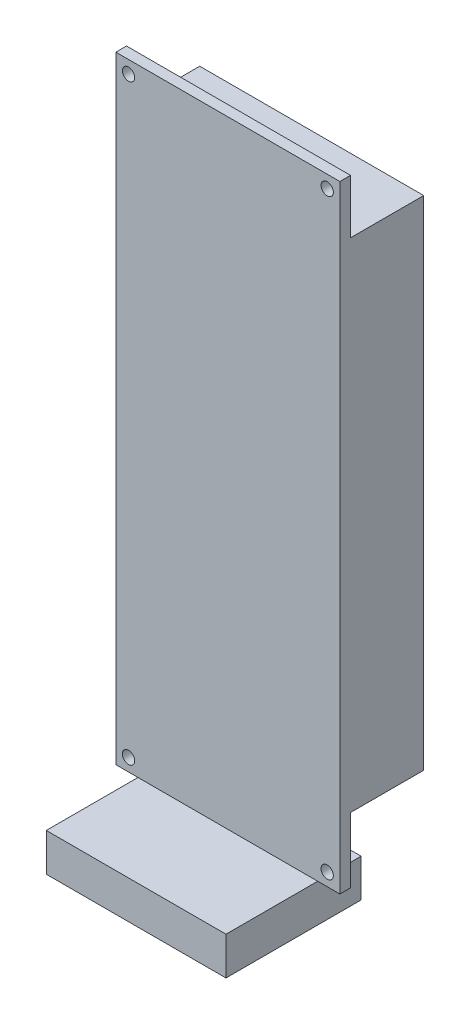
ISO-10303-21;
HEADER;
FILE_DESCRIPTION(('STEP AP214'),'2;1');
FILE_NAME('part.step','',(''),(''),'','','');
FILE_SCHEMA(('AUTOMOTIVE_DESIGN { 1 0 10303 214 1 1 1 1 }'));
ENDSEC;
DATA;
#1=APPLICATION_CONTEXT('core data for automotive mechanical design processes');
#2=APPLICATION_PROTOCOL_DEFINITION('international standard','automotive_design',2000,#1);
#3=PRODUCT_CONTEXT('',#1,'mechanical');
#4=PRODUCT('Part','Part','',(#3));
#5=PRODUCT_RELATED_PRODUCT_CATEGORY('part','',(#4));
#6=PRODUCT_DEFINITION_FORMATION('','',#4);
#7=PRODUCT_DEFINITION_CONTEXT('part definition',#1,'design');
#8=PRODUCT_DEFINITION('design','',#6,#7);
#9=PRODUCT_DEFINITION_SHAPE('','',#8);
#10=(LENGTH_UNIT() NAMED_UNIT(*) SI_UNIT(.MILLI.,.METRE.));
#11=(NAMED_UNIT(*) PLANE_ANGLE_UNIT() SI_UNIT($,.RADIAN.));
#12=(NAMED_UNIT(*) SI_UNIT($,.STERADIAN.) SOLID_ANGLE_UNIT());
#13=UNCERTAINTY_MEASURE_WITH_UNIT(LENGTH_MEASURE(1.E-05),#10,'distance_accuracy_value','');
#14=(GEOMETRIC_REPRESENTATION_CONTEXT(3) GLOBAL_UNCERTAINTY_ASSIGNED_CONTEXT((#13)) GLOBAL_UNIT_ASSIGNED_CONTEXT((#10,
#11,#12)) REPRESENTATION_CONTEXT('',''));
#15=CARTESIAN_POINT('',(0.,0.,0.));
#16=DIRECTION('',(0.,0.,1.));
#17=DIRECTION('',(1.,0.,0.));
#18=AXIS2_PLACEMENT_3D('',#15,#16,#17);
#19=CARTESIAN_POINT('',(0.,0.,1.6));
#20=DIRECTION('',(0.,1.,0.));
#21=DIRECTION('',(0.,0.,1.));
#22=AXIS2_PLACEMENT_3D('',#19,#20,#21);
#23=PLANE('',#22);
#24=DIRECTION('',(0.,0.,1.));
#25=VECTOR('',#24,1.);
#26=CARTESIAN_POINT('',(30.325,0.,-4.92));
#27=LINE('',#26,#25);
#28=CARTESIAN_POINT('',(30.325,0.,0.));
#29=VERTEX_POINT('',#28);
#30=CARTESIAN_POINT('',(30.325,0.,1.6));
#31=VERTEX_POINT('',#30);
#32=EDGE_CURVE('E11',#29,#31,#27,.T.);
#33=ORIENTED_EDGE('',*,*,#32,.F.);
#34=DIRECTION('',(1.,0.,0.));
#35=VECTOR('',#34,1.);
#36=CARTESIAN_POINT('',(0.,0.,0.));
#37=LINE('',#36,#35);
#38=CARTESIAN_POINT('',(33.655,0.,0.));
#39=VERTEX_POINT('',#38);
#40=EDGE_CURVE('E235',#29,#39,#37,.T.);
#41=ORIENTED_EDGE('',*,*,#40,.T.);
#42=DIRECTION('',(0.,0.,-1.));
#43=VECTOR('',#42,1.);
#44=CARTESIAN_POINT('',(33.655,0.,1.6));
#45=LINE('',#44,#43);
#46=CARTESIAN_POINT('',(33.655,0.,1.6));
#47=VERTEX_POINT('',#46);
#48=EDGE_CURVE('E248',#47,#39,#45,.T.);
#49=ORIENTED_EDGE('',*,*,#48,.F.);
#50=DIRECTION('',(1.,0.,0.));
#51=VECTOR('',#50,1.);
#52=CARTESIAN_POINT('',(0.,0.,1.6));
#53=LINE('',#52,#51);
#54=EDGE_CURVE('E53',#31,#47,#53,.T.);
#55=ORIENTED_EDGE('',*,*,#54,.F.);
#56=EDGE_LOOP('',(#33,#41,#49,#55));
#57=FACE_BOUND('',#56,.T.);
#58=ADVANCED_FACE('F34',(#57),#23,.F.);
#59=DIRECTION('',(0.,0.,-1.));
#60=VECTOR('',#59,1.);
#61=CARTESIAN_POINT('',(3.32500000000001,0.,-4.92));
#62=LINE('',#61,#60);
#63=CARTESIAN_POINT('',(3.325,0.,1.6));
#64=VERTEX_POINT('',#63);
#65=CARTESIAN_POINT('',(3.32500000000001,0.,0.));
#66=VERTEX_POINT('',#65);
#67=EDGE_CURVE('E43',#64,#66,#62,.T.);
#68=ORIENTED_EDGE('',*,*,#67,.F.);
#69=CARTESIAN_POINT('',(0.,0.,1.6));
#70=VERTEX_POINT('',#69);
#71=EDGE_CURVE('E224',#70,#64,#53,.T.);
#72=ORIENTED_EDGE('',*,*,#71,.F.);
#73=DIRECTION('',(0.,0.,-1.));
#74=VECTOR('',#73,1.);
#75=CARTESIAN_POINT('',(0.,0.,1.6));
#76=LINE('',#75,#74);
#77=CARTESIAN_POINT('',(0.,0.,0.));
#78=VERTEX_POINT('',#77);
#79=EDGE_CURVE('E38',#70,#78,#76,.T.);
#80=ORIENTED_EDGE('',*,*,#79,.T.);
#81=EDGE_CURVE('E236',#78,#66,#37,.T.);
#82=ORIENTED_EDGE('',*,*,#81,.T.);
#83=EDGE_LOOP('',(#68,#72,#80,#82));
#84=FACE_BOUND('',#83,.T.);
#85=ADVANCED_FACE('F326',(#84),#23,.F.);
#86=CARTESIAN_POINT('',(0.,0.,0.));
#87=DIRECTION('',(0.,0.,-1.));
#88=DIRECTION('',(-1.,0.,0.));
#89=AXIS2_PLACEMENT_3D('',#86,#87,#88);
#90=PLANE('',#89);
#91=DIRECTION('',(1.,0.,0.));
#92=VECTOR('',#91,1.);
#93=CARTESIAN_POINT('',(33.655,84.5804232269216,0.));
#94=LINE('',#93,#92);
#95=CARTESIAN_POINT('',(0.,84.5804232269216,0.));
#96=VERTEX_POINT('',#95);
#97=CARTESIAN_POINT('',(33.655,84.5804232269216,0.));
#98=VERTEX_POINT('',#97);
#99=EDGE_CURVE('E166',#96,#98,#94,.T.);
#100=ORIENTED_EDGE('',*,*,#99,.F.);
#101=DIRECTION('',(0.,-1.,0.));
#102=VECTOR('',#101,1.);
#103=CARTESIAN_POINT('',(0.,0.,0.));
#104=LINE('',#103,#102);
#105=CARTESIAN_POINT('',(0.,92.71,0.));
#106=VERTEX_POINT('',#105);
#107=EDGE_CURVE('E232',#106,#96,#104,.T.);
#108=ORIENTED_EDGE('',*,*,#107,.F.);
#109=DIRECTION('',(-1.,0.,0.));
#110=VECTOR('',#109,1.);
#111=CARTESIAN_POINT('',(0.,92.71,0.));
#112=LINE('',#111,#110);
#113=CARTESIAN_POINT('',(33.655,92.71,0.));
#114=VERTEX_POINT('',#113);
#115=EDGE_CURVE('E223',#114,#106,#112,.T.);
#116=ORIENTED_EDGE('',*,*,#115,.F.);
#117=DIRECTION('',(0.,1.,0.));
#118=VECTOR('',#117,1.);
#119=CARTESIAN_POINT('',(33.655,0.,0.));
#120=LINE('',#119,#118);
#121=EDGE_CURVE('E238',#98,#114,#120,.T.);
#122=ORIENTED_EDGE('',*,*,#121,.F.);
#123=EDGE_LOOP('',(#100,#108,#116,#122));
#124=FACE_BOUND('',#123,.T.);
#125=CARTESIAN_POINT('',(31.75,90.805,0.));
#126=DIRECTION('',(0.,0.,1.));
#127=DIRECTION('',(1.,0.,0.));
#128=AXIS2_PLACEMENT_3D('',#125,#126,#127);
#129=CIRCLE('',#128,0.925000000000001);
#130=CARTESIAN_POINT('',(32.675,90.805,0.));
#131=VERTEX_POINT('',#130);
#132=EDGE_CURVE('E205',#131,#131,#129,.T.);
#133=ORIENTED_EDGE('',*,*,#132,.T.);
#134=EDGE_LOOP('',(#133));
#135=FACE_BOUND('',#134,.T.);
#136=CARTESIAN_POINT('',(1.905,90.805,0.));
#137=DIRECTION('',(0.,0.,1.));
#138=DIRECTION('',(1.,0.,0.));
#139=AXIS2_PLACEMENT_3D('',#136,#137,#138);
#140=CIRCLE('',#139,0.924999999999996);
#141=CARTESIAN_POINT('',(2.83,90.805,0.));
#142=VERTEX_POINT('',#141);
#143=EDGE_CURVE('E211',#142,#142,#140,.T.);
#144=ORIENTED_EDGE('',*,*,#143,.T.);
#145=EDGE_LOOP('',(#144));
#146=FACE_BOUND('',#145,.T.);
#147=ADVANCED_FACE('F301',(#124,#135,#146),#90,.T.);
#148=CARTESIAN_POINT('',(0.,0.,1.6));
#149=DIRECTION('',(0.,0.,-1.));
#150=DIRECTION('',(-1.,0.,0.));
#151=AXIS2_PLACEMENT_3D('',#148,#149,#150);
#152=PLANE('',#151);
#153=DIRECTION('',(0.,-1.,0.));
#154=VECTOR('',#153,1.);
#155=CARTESIAN_POINT('',(0.,0.,1.6));
#156=LINE('',#155,#154);
#157=CARTESIAN_POINT('',(0.,92.71,1.6));
#158=VERTEX_POINT('',#157);
#159=EDGE_CURVE('E220',#158,#70,#156,.T.);
#160=ORIENTED_EDGE('',*,*,#159,.T.);
#161=ORIENTED_EDGE('',*,*,#71,.T.);
#162=EDGE_CURVE('E227',#64,#31,#53,.T.);
#163=ORIENTED_EDGE('',*,*,#162,.T.);
#164=ORIENTED_EDGE('',*,*,#54,.T.);
#165=DIRECTION('',(0.,1.,0.));
#166=VECTOR('',#165,1.);
#167=CARTESIAN_POINT('',(33.655,0.,1.6));
#168=LINE('',#167,#166);
#169=CARTESIAN_POINT('',(33.655,92.71,1.6));
#170=VERTEX_POINT('',#169);
#171=EDGE_CURVE('E226',#47,#170,#168,.T.);
#172=ORIENTED_EDGE('',*,*,#171,.T.);
#173=DIRECTION('',(-1.,0.,0.));
#174=VECTOR('',#173,1.);
#175=CARTESIAN_POINT('',(0.,92.71,1.6));
#176=LINE('',#175,#174);
#177=EDGE_CURVE('E229',#170,#158,#176,.T.);
#178=ORIENTED_EDGE('',*,*,#177,.T.);
#179=EDGE_LOOP('',(#160,#161,#163,#164,#172,#178));
#180=FACE_BOUND('',#179,.T.);
#181=CARTESIAN_POINT('',(1.905,90.805,1.6));
#182=DIRECTION('',(0.,0.,1.));
#183=DIRECTION('',(1.,0.,0.));
#184=AXIS2_PLACEMENT_3D('',#181,#182,#183);
#185=CIRCLE('',#184,0.924999999999996);
#186=CARTESIAN_POINT('',(2.83,90.805,1.6));
#187=VERTEX_POINT('',#186);
#188=EDGE_CURVE('E214',#187,#187,#185,.T.);
#189=ORIENTED_EDGE('',*,*,#188,.F.);
#190=EDGE_LOOP('',(#189));
#191=FACE_BOUND('',#190,.T.);
#192=CARTESIAN_POINT('',(31.75,90.805,1.6));
#193=DIRECTION('',(0.,0.,1.));
#194=DIRECTION('',(1.,0.,0.));
#195=AXIS2_PLACEMENT_3D('',#192,#193,#194);
#196=CIRCLE('',#195,0.925000000000001);
#197=CARTESIAN_POINT('',(32.675,90.805,1.6));
#198=VERTEX_POINT('',#197);
#199=EDGE_CURVE('E208',#198,#198,#196,.T.);
#200=ORIENTED_EDGE('',*,*,#199,.F.);
#201=EDGE_LOOP('',(#200));
#202=FACE_BOUND('',#201,.T.);
#203=CARTESIAN_POINT('',(1.905,1.905,1.6));
#204=DIRECTION('',(0.,0.,1.));
#205=DIRECTION('',(1.,0.,0.));
#206=AXIS2_PLACEMENT_3D('',#203,#204,#205);
#207=CIRCLE('',#206,0.925000000000001);
#208=CARTESIAN_POINT('',(2.83,1.905,1.6));
#209=VERTEX_POINT('',#208);
#210=EDGE_CURVE('E202',#209,#209,#207,.T.);
#211=ORIENTED_EDGE('',*,*,#210,.F.);
#212=EDGE_LOOP('',(#211));
#213=FACE_BOUND('',#212,.T.);
#214=CARTESIAN_POINT('',(31.75,1.905,1.6));
#215=DIRECTION('',(0.,0.,1.));
#216=DIRECTION('',(1.,0.,0.));
#217=AXIS2_PLACEMENT_3D('',#214,#215,#216);
#218=CIRCLE('',#217,0.925000000000002);
#219=CARTESIAN_POINT('',(32.675,1.905,1.6));
#220=VERTEX_POINT('',#219);
#221=EDGE_CURVE('E196',#220,#220,#218,.T.);
#222=ORIENTED_EDGE('',*,*,#221,.F.);
#223=EDGE_LOOP('',(#222));
#224=FACE_BOUND('',#223,.T.);
#225=ADVANCED_FACE('F311',(#180,#191,#202,#213,#224),#152,.F.);
#226=DIRECTION('',(-1.,0.,0.));
#227=VECTOR('',#226,1.);
#228=CARTESIAN_POINT('',(33.655,9.80429411051197,0.));
#229=LINE('',#228,#227);
#230=CARTESIAN_POINT('',(33.655,9.80429411051196,0.));
#231=VERTEX_POINT('',#230);
#232=CARTESIAN_POINT('',(0.,9.80429411051197,0.));
#233=VERTEX_POINT('',#232);
#234=EDGE_CURVE('E163',#231,#233,#229,.T.);
#235=ORIENTED_EDGE('',*,*,#234,.F.);
#236=EDGE_CURVE('E240',#39,#231,#120,.T.);
#237=ORIENTED_EDGE('',*,*,#236,.F.);
#238=ORIENTED_EDGE('',*,*,#40,.F.);
#239=EDGE_CURVE('E239',#66,#29,#37,.T.);
#240=ORIENTED_EDGE('',*,*,#239,.F.);
#241=ORIENTED_EDGE('',*,*,#81,.F.);
#242=EDGE_CURVE('E217',#233,#78,#104,.T.);
#243=ORIENTED_EDGE('',*,*,#242,.F.);
#244=EDGE_LOOP('',(#235,#237,#238,#240,#241,#243));
#245=FACE_BOUND('',#244,.T.);
#246=CARTESIAN_POINT('',(1.905,1.905,0.));
#247=DIRECTION('',(0.,0.,1.));
#248=DIRECTION('',(1.,0.,0.));
#249=AXIS2_PLACEMENT_3D('',#246,#247,#248);
#250=CIRCLE('',#249,0.925000000000001);
#251=CARTESIAN_POINT('',(2.83,1.905,0.));
#252=VERTEX_POINT('',#251);
#253=EDGE_CURVE('E199',#252,#252,#250,.T.);
#254=ORIENTED_EDGE('',*,*,#253,.T.);
#255=EDGE_LOOP('',(#254));
#256=FACE_BOUND('',#255,.T.);
#257=CARTESIAN_POINT('',(31.75,1.905,0.));
#258=DIRECTION('',(0.,0.,1.));
#259=DIRECTION('',(1.,0.,0.));
#260=AXIS2_PLACEMENT_3D('',#257,#258,#259);
#261=CIRCLE('',#260,0.925000000000002);
#262=CARTESIAN_POINT('',(32.675,1.905,0.));
#263=VERTEX_POINT('',#262);
#264=EDGE_CURVE('E195',#263,#263,#261,.T.);
#265=ORIENTED_EDGE('',*,*,#264,.T.);
#266=EDGE_LOOP('',(#265));
#267=FACE_BOUND('',#266,.T.);
#268=ADVANCED_FACE('F282',(#245,#256,#267),#90,.T.);
#269=CARTESIAN_POINT('',(0.,0.,1.6));
#270=DIRECTION('',(1.,0.,0.));
#271=DIRECTION('',(0.,0.,-1.));
#272=AXIS2_PLACEMENT_3D('',#269,#270,#271);
#273=PLANE('',#272);
#274=ORIENTED_EDGE('',*,*,#107,.T.);
#275=DIRECTION('',(0.,0.,1.));
#276=VECTOR('',#275,1.);
#277=CARTESIAN_POINT('',(0.,84.5804232269216,-11.));
#278=LINE('',#277,#276);
#279=CARTESIAN_POINT('',(0.,84.5804232269216,-11.));
#280=VERTEX_POINT('',#279);
#281=EDGE_CURVE('E186',#280,#96,#278,.T.);
#282=ORIENTED_EDGE('',*,*,#281,.F.);
#283=DIRECTION('',(0.,1.,0.));
#284=VECTOR('',#283,1.);
#285=CARTESIAN_POINT('',(0.,84.5804232269216,-11.));
#286=LINE('',#285,#284);
#287=CARTESIAN_POINT('',(0.,9.80429411051197,-11.));
#288=VERTEX_POINT('',#287);
#289=EDGE_CURVE('E177',#288,#280,#286,.T.);
#290=ORIENTED_EDGE('',*,*,#289,.F.);
#291=DIRECTION('',(0.,0.,1.));
#292=VECTOR('',#291,1.);
#293=CARTESIAN_POINT('',(0.,9.80429411051197,-11.));
#294=LINE('',#293,#292);
#295=EDGE_CURVE('E189',#288,#233,#294,.T.);
#296=ORIENTED_EDGE('',*,*,#295,.T.);
#297=ORIENTED_EDGE('',*,*,#242,.T.);
#298=ORIENTED_EDGE('',*,*,#79,.F.);
#299=ORIENTED_EDGE('',*,*,#159,.F.);
#300=DIRECTION('',(0.,0.,-1.));
#301=VECTOR('',#300,1.);
#302=CARTESIAN_POINT('',(0.,92.71,1.6));
#303=LINE('',#302,#301);
#304=EDGE_CURVE('E231',#158,#106,#303,.T.);
#305=ORIENTED_EDGE('',*,*,#304,.T.);
#306=EDGE_LOOP('',(#274,#282,#290,#296,#297,#298,#299,#305));
#307=FACE_BOUND('',#306,.T.);
#308=ADVANCED_FACE('F36',(#307),#273,.F.);
#309=CARTESIAN_POINT('',(33.655,0.,1.6));
#310=DIRECTION('',(-1.,0.,0.));
#311=DIRECTION('',(0.,0.,1.));
#312=AXIS2_PLACEMENT_3D('',#309,#310,#311);
#313=PLANE('',#312);
#314=ORIENTED_EDGE('',*,*,#236,.T.);
#315=DIRECTION('',(0.,0.,1.));
#316=VECTOR('',#315,1.);
#317=CARTESIAN_POINT('',(33.655,9.80429411051197,-11.));
#318=LINE('',#317,#316);
#319=CARTESIAN_POINT('',(33.655,9.80429411051197,-11.));
#320=VERTEX_POINT('',#319);
#321=EDGE_CURVE('E192',#320,#231,#318,.T.);
#322=ORIENTED_EDGE('',*,*,#321,.F.);
#323=DIRECTION('',(0.,-1.,0.));
#324=VECTOR('',#323,1.);
#325=CARTESIAN_POINT('',(33.655,84.5804232269216,-11.));
#326=LINE('',#325,#324);
#327=CARTESIAN_POINT('',(33.655,84.5804232269216,-11.));
#328=VERTEX_POINT('',#327);
#329=EDGE_CURVE('E172',#328,#320,#326,.T.);
#330=ORIENTED_EDGE('',*,*,#329,.F.);
#331=DIRECTION('',(0.,0.,1.));
#332=VECTOR('',#331,1.);
#333=CARTESIAN_POINT('',(33.655,84.5804232269216,-11.));
#334=LINE('',#333,#332);
#335=EDGE_CURVE('E180',#328,#98,#334,.T.);
#336=ORIENTED_EDGE('',*,*,#335,.T.);
#337=ORIENTED_EDGE('',*,*,#121,.T.);
#338=DIRECTION('',(0.,0.,-1.));
#339=VECTOR('',#338,1.);
#340=CARTESIAN_POINT('',(33.655,92.71,1.6));
#341=LINE('',#340,#339);
#342=EDGE_CURVE('E246',#170,#114,#341,.T.);
#343=ORIENTED_EDGE('',*,*,#342,.F.);
#344=ORIENTED_EDGE('',*,*,#171,.F.);
#345=ORIENTED_EDGE('',*,*,#48,.T.);
#346=EDGE_LOOP('',(#314,#322,#330,#336,#337,#343,#344,#345));
#347=FACE_BOUND('',#346,.T.);
#348=ADVANCED_FACE('F285',(#347),#313,.F.);
#349=CARTESIAN_POINT('',(0.,92.71,1.6));
#350=DIRECTION('',(0.,-1.,0.));
#351=DIRECTION('',(0.,0.,-1.));
#352=AXIS2_PLACEMENT_3D('',#349,#350,#351);
#353=PLANE('',#352);
#354=ORIENTED_EDGE('',*,*,#115,.T.);
#355=ORIENTED_EDGE('',*,*,#304,.F.);
#356=ORIENTED_EDGE('',*,*,#177,.F.);
#357=ORIENTED_EDGE('',*,*,#342,.T.);
#358=EDGE_LOOP('',(#354,#355,#356,#357));
#359=FACE_BOUND('',#358,.T.);
#360=ADVANCED_FACE('F309',(#359),#353,.F.);
#361=CARTESIAN_POINT('',(1.905,90.805,1.6));
#362=DIRECTION('',(0.,0.,-1.));
#363=DIRECTION('',(-1.,0.,0.));
#364=AXIS2_PLACEMENT_3D('',#361,#362,#363);
#365=CYLINDRICAL_SURFACE('',#364,0.924999999999996);
#366=ORIENTED_EDGE('',*,*,#188,.T.);
#367=EDGE_LOOP('',(#366));
#368=FACE_BOUND('',#367,.T.);
#369=ORIENTED_EDGE('',*,*,#143,.F.);
#370=EDGE_LOOP('',(#369));
#371=FACE_BOUND('',#370,.T.);
#372=ADVANCED_FACE('F335',(#368,#371),#365,.F.);
#373=CARTESIAN_POINT('',(31.75,90.805,1.6));
#374=DIRECTION('',(0.,0.,-1.));
#375=DIRECTION('',(-1.,0.,0.));
#376=AXIS2_PLACEMENT_3D('',#373,#374,#375);
#377=CYLINDRICAL_SURFACE('',#376,0.925000000000001);
#378=ORIENTED_EDGE('',*,*,#199,.T.);
#379=EDGE_LOOP('',(#378));
#380=FACE_BOUND('',#379,.T.);
#381=ORIENTED_EDGE('',*,*,#132,.F.);
#382=EDGE_LOOP('',(#381));
#383=FACE_BOUND('',#382,.T.);
#384=ADVANCED_FACE('F342',(#380,#383),#377,.F.);
#385=CARTESIAN_POINT('',(1.905,1.905,1.6));
#386=DIRECTION('',(0.,0.,-1.));
#387=DIRECTION('',(-1.,0.,0.));
#388=AXIS2_PLACEMENT_3D('',#385,#386,#387);
#389=CYLINDRICAL_SURFACE('',#388,0.925000000000001);
#390=ORIENTED_EDGE('',*,*,#210,.T.);
#391=EDGE_LOOP('',(#390));
#392=FACE_BOUND('',#391,.T.);
#393=ORIENTED_EDGE('',*,*,#253,.F.);
#394=EDGE_LOOP('',(#393));
#395=FACE_BOUND('',#394,.T.);
#396=ADVANCED_FACE('F346',(#392,#395),#389,.F.);
#397=CARTESIAN_POINT('',(31.75,1.905,1.6));
#398=DIRECTION('',(0.,0.,-1.));
#399=DIRECTION('',(-1.,0.,0.));
#400=AXIS2_PLACEMENT_3D('',#397,#398,#399);
#401=CYLINDRICAL_SURFACE('',#400,0.925000000000002);
#402=ORIENTED_EDGE('',*,*,#221,.T.);
#403=EDGE_LOOP('',(#402));
#404=FACE_BOUND('',#403,.T.);
#405=ORIENTED_EDGE('',*,*,#264,.F.);
#406=EDGE_LOOP('',(#405));
#407=FACE_BOUND('',#406,.T.);
#408=ADVANCED_FACE('F350',(#404,#407),#401,.F.);
#409=CARTESIAN_POINT('',(33.655,9.80429411051197,-11.));
#410=DIRECTION('',(0.,1.,0.));
#411=DIRECTION('',(0.,0.,1.));
#412=AXIS2_PLACEMENT_3D('',#409,#410,#411);
#413=PLANE('',#412);
#414=ORIENTED_EDGE('',*,*,#234,.T.);
#415=ORIENTED_EDGE('',*,*,#295,.F.);
#416=DIRECTION('',(-1.,0.,0.));
#417=VECTOR('',#416,1.);
#418=CARTESIAN_POINT('',(33.655,9.80429411051197,-11.));
#419=LINE('',#418,#417);
#420=EDGE_CURVE('E175',#320,#288,#419,.T.);
#421=ORIENTED_EDGE('',*,*,#420,.F.);
#422=ORIENTED_EDGE('',*,*,#321,.T.);
#423=EDGE_LOOP('',(#414,#415,#421,#422));
#424=FACE_BOUND('',#423,.T.);
#425=ADVANCED_FACE('F288',(#424),#413,.F.);
#426=CARTESIAN_POINT('',(33.655,84.5804232269216,-11.));
#427=DIRECTION('',(0.,-1.,0.));
#428=DIRECTION('',(0.,0.,-1.));
#429=AXIS2_PLACEMENT_3D('',#426,#427,#428);
#430=PLANE('',#429);
#431=ORIENTED_EDGE('',*,*,#99,.T.);
#432=ORIENTED_EDGE('',*,*,#335,.F.);
#433=DIRECTION('',(1.,0.,0.));
#434=VECTOR('',#433,1.);
#435=CARTESIAN_POINT('',(33.655,84.5804232269216,-11.));
#436=LINE('',#435,#434);
#437=EDGE_CURVE('E179',#280,#328,#436,.T.);
#438=ORIENTED_EDGE('',*,*,#437,.F.);
#439=ORIENTED_EDGE('',*,*,#281,.T.);
#440=EDGE_LOOP('',(#431,#432,#438,#439));
#441=FACE_BOUND('',#440,.T.);
#442=ADVANCED_FACE('F297',(#441),#430,.F.);
#443=CARTESIAN_POINT('',(0.,0.,-11.));
#444=DIRECTION('',(0.,0.,-1.));
#445=DIRECTION('',(-1.,0.,0.));
#446=AXIS2_PLACEMENT_3D('',#443,#444,#445);
#447=PLANE('',#446);
#448=ORIENTED_EDGE('',*,*,#329,.T.);
#449=ORIENTED_EDGE('',*,*,#420,.T.);
#450=ORIENTED_EDGE('',*,*,#289,.T.);
#451=ORIENTED_EDGE('',*,*,#437,.T.);
#452=EDGE_LOOP('',(#448,#449,#450,#451));
#453=FACE_BOUND('',#452,.T.);
#454=ADVANCED_FACE('F292',(#453),#447,.T.);
#455=CARTESIAN_POINT('',(0.,0.,0.));
#456=DIRECTION('',(0.,-1.,0.));
#457=DIRECTION('',(0.,0.,-1.));
#458=AXIS2_PLACEMENT_3D('',#455,#456,#457);
#459=PLANE('',#458);
#460=CARTESIAN_POINT('',(3.32500000000001,0.,-4.92));
#461=VERTEX_POINT('',#460);
#462=EDGE_CURVE('E257',#66,#461,#62,.T.);
#463=ORIENTED_EDGE('',*,*,#462,.F.);
#464=ORIENTED_EDGE('',*,*,#239,.T.);
#465=CARTESIAN_POINT('',(30.325,0.,-4.92));
#466=VERTEX_POINT('',#465);
#467=EDGE_CURVE('E45',#466,#29,#27,.T.);
#468=ORIENTED_EDGE('',*,*,#467,.F.);
#469=DIRECTION('',(1.,0.,0.));
#470=VECTOR('',#469,1.);
#471=CARTESIAN_POINT('',(30.325,0.,-4.92));
#472=LINE('',#471,#470);
#473=EDGE_CURVE('E157',#461,#466,#472,.T.);
#474=ORIENTED_EDGE('',*,*,#473,.F.);
#475=EDGE_LOOP('',(#463,#464,#468,#474));
#476=FACE_BOUND('',#475,.T.);
#477=ADVANCED_FACE('F277',(#476),#459,.F.);
#478=CARTESIAN_POINT('',(30.325,-5.7,-4.92));
#479=DIRECTION('',(-1.,0.,0.));
#480=DIRECTION('',(0.,0.,1.));
#481=AXIS2_PLACEMENT_3D('',#478,#479,#480);
#482=PLANE('',#481);
#483=ORIENTED_EDGE('',*,*,#467,.T.);
#484=ORIENTED_EDGE('',*,*,#32,.T.);
#485=CARTESIAN_POINT('',(30.325,0.,15.38));
#486=VERTEX_POINT('',#485);
#487=EDGE_CURVE('E46',#31,#486,#27,.T.);
#488=ORIENTED_EDGE('',*,*,#487,.T.);
#489=DIRECTION('',(0.,1.,0.));
#490=VECTOR('',#489,1.);
#491=CARTESIAN_POINT('',(30.325,-5.7,15.38));
#492=LINE('',#491,#490);
#493=CARTESIAN_POINT('',(30.325,-5.7,15.38));
#494=VERTEX_POINT('',#493);
#495=EDGE_CURVE('E142',#494,#486,#492,.T.);
#496=ORIENTED_EDGE('',*,*,#495,.F.);
#497=DIRECTION('',(0.,0.,1.));
#498=VECTOR('',#497,1.);
#499=CARTESIAN_POINT('',(30.325,-5.7,-4.92));
#500=LINE('',#499,#498);
#501=CARTESIAN_POINT('',(30.325,-5.7,-4.92));
#502=VERTEX_POINT('',#501);
#503=EDGE_CURVE('E148',#502,#494,#500,.T.);
#504=ORIENTED_EDGE('',*,*,#503,.F.);
#505=DIRECTION('',(0.,1.,0.));
#506=VECTOR('',#505,1.);
#507=CARTESIAN_POINT('',(30.325,-5.7,-4.92));
#508=LINE('',#507,#506);
#509=EDGE_CURVE('E268',#502,#466,#508,.T.);
#510=ORIENTED_EDGE('',*,*,#509,.T.);
#511=EDGE_LOOP('',(#483,#484,#488,#496,#504,#510));
#512=FACE_BOUND('',#511,.T.);
#513=ADVANCED_FACE('F160',(#512),#482,.F.);
#514=CARTESIAN_POINT('',(30.325,-5.7,15.38));
#515=DIRECTION('',(0.,0.,-1.));
#516=DIRECTION('',(-1.,0.,0.));
#517=AXIS2_PLACEMENT_3D('',#514,#515,#516);
#518=PLANE('',#517);
#519=DIRECTION('',(-1.,0.,0.));
#520=VECTOR('',#519,1.);
#521=CARTESIAN_POINT('',(30.325,0.,15.38));
#522=LINE('',#521,#520);
#523=CARTESIAN_POINT('',(3.32500000000001,0.,15.38));
#524=VERTEX_POINT('',#523);
#525=EDGE_CURVE('E262',#486,#524,#522,.T.);
#526=ORIENTED_EDGE('',*,*,#525,.T.);
#527=DIRECTION('',(0.,1.,0.));
#528=VECTOR('',#527,1.);
#529=CARTESIAN_POINT('',(3.32500000000001,-5.7,15.38));
#530=LINE('',#529,#528);
#531=CARTESIAN_POINT('',(3.32500000000001,-5.7,15.38));
#532=VERTEX_POINT('',#531);
#533=EDGE_CURVE('E144',#532,#524,#530,.T.);
#534=ORIENTED_EDGE('',*,*,#533,.F.);
#535=DIRECTION('',(-1.,0.,0.));
#536=VECTOR('',#535,1.);
#537=CARTESIAN_POINT('',(30.325,-5.7,15.38));
#538=LINE('',#537,#536);
#539=EDGE_CURVE('E138',#494,#532,#538,.T.);
#540=ORIENTED_EDGE('',*,*,#539,.F.);
#541=ORIENTED_EDGE('',*,*,#495,.T.);
#542=EDGE_LOOP('',(#526,#534,#540,#541));
#543=FACE_BOUND('',#542,.T.);
#544=ADVANCED_FACE('F140',(#543),#518,.F.);
#545=CARTESIAN_POINT('',(3.32500000000001,-5.7,-4.92));
#546=DIRECTION('',(1.,0.,0.));
#547=DIRECTION('',(0.,0.,-1.));
#548=AXIS2_PLACEMENT_3D('',#545,#546,#547);
#549=PLANE('',#548);
#550=EDGE_CURVE('E256',#524,#64,#62,.T.);
#551=ORIENTED_EDGE('',*,*,#550,.T.);
#552=ORIENTED_EDGE('',*,*,#67,.T.);
#553=ORIENTED_EDGE('',*,*,#462,.T.);
#554=DIRECTION('',(0.,1.,0.));
#555=VECTOR('',#554,1.);
#556=CARTESIAN_POINT('',(3.32500000000001,-5.7,-4.92));
#557=LINE('',#556,#555);
#558=CARTESIAN_POINT('',(3.32500000000001,-5.7,-4.92));
#559=VERTEX_POINT('',#558);
#560=EDGE_CURVE('E168',#559,#461,#557,.T.);
#561=ORIENTED_EDGE('',*,*,#560,.F.);
#562=DIRECTION('',(0.,0.,-1.));
#563=VECTOR('',#562,1.);
#564=CARTESIAN_POINT('',(3.32500000000001,-5.7,-4.92));
#565=LINE('',#564,#563);
#566=EDGE_CURVE('E147',#532,#559,#565,.T.);
#567=ORIENTED_EDGE('',*,*,#566,.F.);
#568=ORIENTED_EDGE('',*,*,#533,.T.);
#569=EDGE_LOOP('',(#551,#552,#553,#561,#567,#568));
#570=FACE_BOUND('',#569,.T.);
#571=ADVANCED_FACE('F269',(#570),#549,.F.);
#572=CARTESIAN_POINT('',(30.325,-5.7,-4.92));
#573=DIRECTION('',(0.,0.,1.));
#574=DIRECTION('',(1.,0.,0.));
#575=AXIS2_PLACEMENT_3D('',#572,#573,#574);
#576=PLANE('',#575);
#577=ORIENTED_EDGE('',*,*,#473,.T.);
#578=ORIENTED_EDGE('',*,*,#509,.F.);
#579=DIRECTION('',(1.,0.,0.));
#580=VECTOR('',#579,1.);
#581=CARTESIAN_POINT('',(30.325,-5.7,-4.92));
#582=LINE('',#581,#580);
#583=EDGE_CURVE('E153',#559,#502,#582,.T.);
#584=ORIENTED_EDGE('',*,*,#583,.F.);
#585=ORIENTED_EDGE('',*,*,#560,.T.);
#586=EDGE_LOOP('',(#577,#578,#584,#585));
#587=FACE_BOUND('',#586,.T.);
#588=ADVANCED_FACE('F272',(#587),#576,.F.);
#589=CARTESIAN_POINT('',(0.,-5.7,0.));
#590=DIRECTION('',(0.,-1.,0.));
#591=DIRECTION('',(0.,0.,-1.));
#592=AXIS2_PLACEMENT_3D('',#589,#590,#591);
#593=PLANE('',#592);
#594=ORIENTED_EDGE('',*,*,#503,.T.);
#595=ORIENTED_EDGE('',*,*,#539,.T.);
#596=ORIENTED_EDGE('',*,*,#566,.T.);
#597=ORIENTED_EDGE('',*,*,#583,.T.);
#598=EDGE_LOOP('',(#594,#595,#596,#597));
#599=FACE_BOUND('',#598,.T.);
#600=ADVANCED_FACE('F151',(#599),#593,.T.);
#601=ORIENTED_EDGE('',*,*,#162,.F.);
#602=ORIENTED_EDGE('',*,*,#550,.F.);
#603=ORIENTED_EDGE('',*,*,#525,.F.);
#604=ORIENTED_EDGE('',*,*,#487,.F.);
#605=EDGE_LOOP('',(#601,#602,#603,#604));
#606=FACE_BOUND('',#605,.T.);
#607=ADVANCED_FACE('F316',(#606),#459,.F.);
#608=CLOSED_SHELL('',(#58,#85,#147,#225,#268,#308,#348,#360,#372,#384,#396,#408,#425,#442,#454,
#477,#513,#544,#571,#588,#600,#607));
#609=MANIFOLD_SOLID_BREP('B2',#608);
#610=ADVANCED_BREP_SHAPE_REPRESENTATION('',(#18,#609),#14);
#611=SHAPE_DEFINITION_REPRESENTATION(#9,#610);
ENDSEC;
END-ISO-10303-21;
